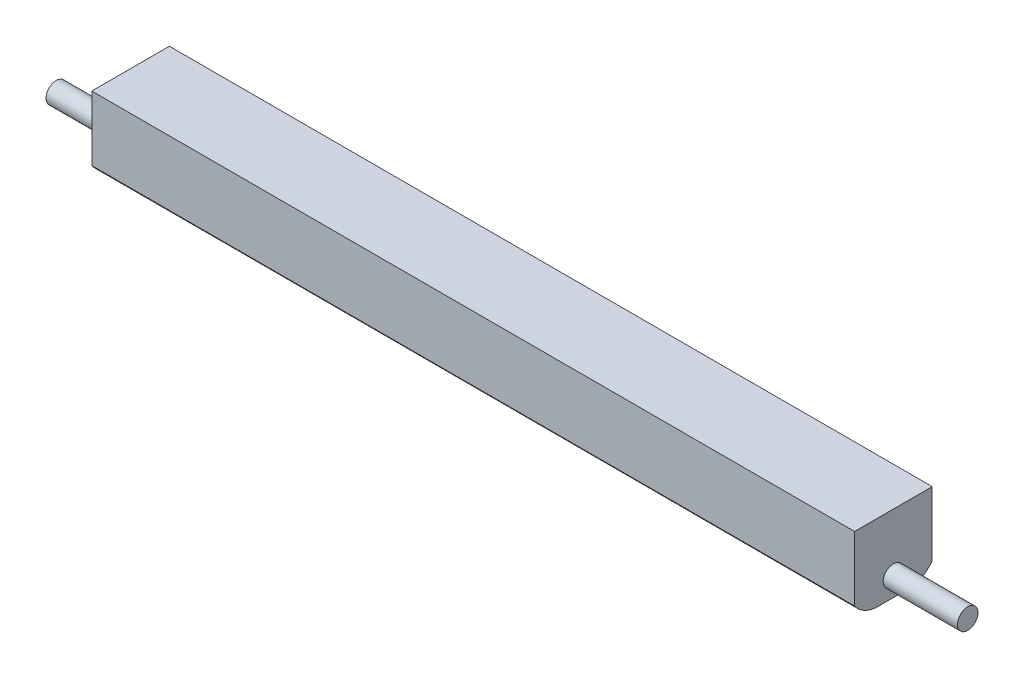
ISO-10303-21;
HEADER;
FILE_DESCRIPTION(('STEP AP214'),'2;1');
FILE_NAME('part.step','',(''),(''),'','','');
FILE_SCHEMA(('AUTOMOTIVE_DESIGN { 1 0 10303 214 1 1 1 1 }'));
ENDSEC;
DATA;
#1=APPLICATION_CONTEXT('core data for automotive mechanical design processes');
#2=APPLICATION_PROTOCOL_DEFINITION('international standard','automotive_design',2000,#1);
#3=PRODUCT_CONTEXT('',#1,'mechanical');
#4=PRODUCT('Part','Part','',(#3));
#5=PRODUCT_RELATED_PRODUCT_CATEGORY('part','',(#4));
#6=PRODUCT_DEFINITION_FORMATION('','',#4);
#7=PRODUCT_DEFINITION_CONTEXT('part definition',#1,'design');
#8=PRODUCT_DEFINITION('design','',#6,#7);
#9=PRODUCT_DEFINITION_SHAPE('','',#8);
#10=(LENGTH_UNIT() NAMED_UNIT(*) SI_UNIT(.MILLI.,.METRE.));
#11=(NAMED_UNIT(*) PLANE_ANGLE_UNIT() SI_UNIT($,.RADIAN.));
#12=(NAMED_UNIT(*) SI_UNIT($,.STERADIAN.) SOLID_ANGLE_UNIT());
#13=UNCERTAINTY_MEASURE_WITH_UNIT(LENGTH_MEASURE(1.E-05),#10,'distance_accuracy_value','');
#14=(GEOMETRIC_REPRESENTATION_CONTEXT(3) GLOBAL_UNCERTAINTY_ASSIGNED_CONTEXT((#13)) GLOBAL_UNIT_ASSIGNED_CONTEXT((#10,
#11,#12)) REPRESENTATION_CONTEXT('',''));
#15=CARTESIAN_POINT('',(0.,0.,0.));
#16=DIRECTION('',(0.,0.,1.));
#17=DIRECTION('',(1.,0.,0.));
#18=AXIS2_PLACEMENT_3D('',#15,#16,#17);
#19=CARTESIAN_POINT('',(1111.25,0.,0.));
#20=DIRECTION('',(-1.,0.,0.));
#21=DIRECTION('',(0.,0.,1.));
#22=AXIS2_PLACEMENT_3D('',#19,#20,#21);
#23=CYLINDRICAL_SURFACE('',#22,25.);
#24=CARTESIAN_POINT('',(1111.25,0.,0.));
#25=DIRECTION('',(1.,0.,0.));
#26=DIRECTION('',(0.,0.,-1.));
#27=AXIS2_PLACEMENT_3D('',#24,#25,#26);
#28=CIRCLE('',#27,25.);
#29=CARTESIAN_POINT('',(1111.25,0.,-25.));
#30=VERTEX_POINT('',#29);
#31=EDGE_CURVE('E11',#30,#30,#28,.T.);
#32=ORIENTED_EDGE('',*,*,#31,.F.);
#33=EDGE_LOOP('',(#32));
#34=FACE_BOUND('',#33,.T.);
#35=CARTESIAN_POINT('',(-1111.25,0.,0.));
#36=DIRECTION('',(1.,0.,0.));
#37=DIRECTION('',(0.,0.,-1.));
#38=AXIS2_PLACEMENT_3D('',#35,#36,#37);
#39=CIRCLE('',#38,25.);
#40=CARTESIAN_POINT('',(-1111.25,0.,-25.));
#41=VERTEX_POINT('',#40);
#42=EDGE_CURVE('E44',#41,#41,#39,.T.);
#43=ORIENTED_EDGE('',*,*,#42,.T.);
#44=EDGE_LOOP('',(#43));
#45=FACE_BOUND('',#44,.T.);
#46=ADVANCED_FACE('F41',(#34,#45),#23,.T.);
#47=CARTESIAN_POINT('',(1111.25,0.,0.));
#48=DIRECTION('',(1.,0.,0.));
#49=DIRECTION('',(0.,0.,-1.));
#50=AXIS2_PLACEMENT_3D('',#47,#48,#49);
#51=PLANE('',#50);
#52=ORIENTED_EDGE('',*,*,#31,.T.);
#53=EDGE_LOOP('',(#52));
#54=FACE_BOUND('',#53,.T.);
#55=ADVANCED_FACE('F56',(#54),#51,.T.);
#56=CARTESIAN_POINT('',(-1111.25,0.,0.));
#57=DIRECTION('',(1.,0.,0.));
#58=DIRECTION('',(0.,0.,-1.));
#59=AXIS2_PLACEMENT_3D('',#56,#57,#58);
#60=PLANE('',#59);
#61=ORIENTED_EDGE('',*,*,#42,.F.);
#62=EDGE_LOOP('',(#61));
#63=FACE_BOUND('',#62,.T.);
#64=ADVANCED_FACE('F54',(#63),#60,.F.);
#65=CLOSED_SHELL('',(#46,#55,#64));
#66=MANIFOLD_SOLID_BREP('B2',#65);
#67=CARTESIAN_POINT('',(930.000000042,140.618265245851,94.6345425258526));
#68=DIRECTION('',(0.,0.,-1.));
#69=DIRECTION('',(0.,1.,0.));
#70=AXIS2_PLACEMENT_3D('',#67,#68,#69);
#71=PLANE('',#70);
#72=DIRECTION('',(0.,-1.,0.));
#73=VECTOR('',#72,1.);
#74=CARTESIAN_POINT('',(-930.000000042,140.618265245851,94.6345425258526));
#75=LINE('',#74,#73);
#76=CARTESIAN_POINT('',(-930.000000042,140.618265245851,94.6345425258526));
#77=VERTEX_POINT('',#76);
#78=CARTESIAN_POINT('',(-930.000000042,-16.759321043142,94.6345425258526));
#79=VERTEX_POINT('',#78);
#80=EDGE_CURVE('E169',#77,#79,#75,.T.);
#81=ORIENTED_EDGE('',*,*,#80,.T.);
#82=DIRECTION('',(-1.,0.,0.));
#83=VECTOR('',#82,1.);
#84=CARTESIAN_POINT('',(930.000000042,-16.759321043142,94.6345425258526));
#85=LINE('',#84,#83);
#86=CARTESIAN_POINT('',(930.000000042,-16.759321043142,94.6345425258526));
#87=VERTEX_POINT('',#86);
#88=EDGE_CURVE('E39',#87,#79,#85,.T.);
#89=ORIENTED_EDGE('',*,*,#88,.F.);
#90=DIRECTION('',(0.,-1.,0.));
#91=VECTOR('',#90,1.);
#92=CARTESIAN_POINT('',(930.000000042,140.618265245851,94.6345425258526));
#93=LINE('',#92,#91);
#94=CARTESIAN_POINT('',(930.000000042,140.618265245851,94.6345425258526));
#95=VERTEX_POINT('',#94);
#96=EDGE_CURVE('E192',#95,#87,#93,.T.);
#97=ORIENTED_EDGE('',*,*,#96,.F.);
#98=DIRECTION('',(-1.,0.,0.));
#99=VECTOR('',#98,1.);
#100=CARTESIAN_POINT('',(930.000000042,140.618265245851,94.6345425258526));
#101=LINE('',#100,#99);
#102=EDGE_CURVE('E98',#95,#77,#101,.T.);
#103=ORIENTED_EDGE('',*,*,#102,.T.);
#104=EDGE_LOOP('',(#81,#89,#97,#103));
#105=FACE_BOUND('',#104,.T.);
#106=ADVANCED_FACE('F82',(#105),#71,.F.);
#107=CARTESIAN_POINT('',(930.000000042,-16.759321043142,94.6345425258526));
#108=CARTESIAN_POINT('',(930.000000042,-31.6852023182055,84.7963989369958));
#109=CARTESIAN_POINT('',(930.000000042,-41.5438730532494,69.2089918851332));
#110=CARTESIAN_POINT('',(930.000000042,-46.9662086533688,51.6290151755412));
#111=CARTESIAN_POINT('',(930.000000042,-46.3817347541492,38.3838603661238));
#112=B_SPLINE_CURVE_WITH_KNOTS('',4,(#107,#108,#109,#110,#111),.UNSPECIFIED.,.F.,.F.,(5,5),(0.,
1.),.UNSPECIFIED.);
#113=DIRECTION('',(-1.,0.,0.));
#114=VECTOR('',#113,1.);
#115=SURFACE_OF_LINEAR_EXTRUSION('',#112,#114);
#116=CARTESIAN_POINT('',(-930.000000042,-16.759321043142,94.6345425258526));
#117=CARTESIAN_POINT('',(-930.000000042,-31.6852023182055,84.7963989369958));
#118=CARTESIAN_POINT('',(-930.000000042,-41.5438730532494,69.2089918851332));
#119=CARTESIAN_POINT('',(-930.000000042,-46.9662086533688,51.6290151755412));
#120=CARTESIAN_POINT('',(-930.000000042,-46.3817347541492,38.3838603661238));
#121=B_SPLINE_CURVE_WITH_KNOTS('',4,(#116,#117,#118,#119,#120),.UNSPECIFIED.,.F.,.F.,(5,5),(0.,
1.),.UNSPECIFIED.);
#122=CARTESIAN_POINT('',(-930.000000042,-46.3817347541492,38.3838603661238));
#123=VERTEX_POINT('',#122);
#124=EDGE_CURVE('E171',#79,#123,#121,.T.);
#125=ORIENTED_EDGE('',*,*,#124,.T.);
#126=DIRECTION('',(-1.,0.,0.));
#127=VECTOR('',#126,1.);
#128=CARTESIAN_POINT('',(930.000000042,-46.3817347541492,38.3838603661238));
#129=LINE('',#128,#127);
#130=CARTESIAN_POINT('',(930.000000042,-46.3817347541492,38.3838603661238));
#131=VERTEX_POINT('',#130);
#132=EDGE_CURVE('E90',#131,#123,#129,.T.);
#133=ORIENTED_EDGE('',*,*,#132,.F.);
#134=EDGE_CURVE('E130',#87,#131,#112,.T.);
#135=ORIENTED_EDGE('',*,*,#134,.F.);
#136=ORIENTED_EDGE('',*,*,#88,.T.);
#137=EDGE_LOOP('',(#125,#133,#135,#136));
#138=FACE_BOUND('',#137,.T.);
#139=ADVANCED_FACE('F212',(#138),#115,.F.);
#140=CARTESIAN_POINT('',(930.000000042,-46.3817347541492,38.3838603661238));
#141=DIRECTION('',(0.,1.,0.));
#142=DIRECTION('',(0.,0.,1.));
#143=AXIS2_PLACEMENT_3D('',#140,#141,#142);
#144=PLANE('',#143);
#145=DIRECTION('',(0.,0.,-1.));
#146=VECTOR('',#145,1.);
#147=CARTESIAN_POINT('',(-930.000000042,-46.3817347541492,38.3838603661238));
#148=LINE('',#147,#146);
#149=CARTESIAN_POINT('',(-930.000000042,-46.3817347541492,-35.7004036733313));
#150=VERTEX_POINT('',#149);
#151=EDGE_CURVE('E175',#123,#150,#148,.T.);
#152=ORIENTED_EDGE('',*,*,#151,.T.);
#153=DIRECTION('',(-1.,0.,0.));
#154=VECTOR('',#153,1.);
#155=CARTESIAN_POINT('',(930.000000042,-46.3817347541492,-35.7004036733313));
#156=LINE('',#155,#154);
#157=CARTESIAN_POINT('',(930.000000042,-46.3817347541492,-35.7004036733313));
#158=VERTEX_POINT('',#157);
#159=EDGE_CURVE('E149',#158,#150,#156,.T.);
#160=ORIENTED_EDGE('',*,*,#159,.F.);
#161=DIRECTION('',(0.,0.,-1.));
#162=VECTOR('',#161,1.);
#163=CARTESIAN_POINT('',(930.000000042,-46.3817347541492,38.3838603661238));
#164=LINE('',#163,#162);
#165=EDGE_CURVE('E157',#131,#158,#164,.T.);
#166=ORIENTED_EDGE('',*,*,#165,.F.);
#167=ORIENTED_EDGE('',*,*,#132,.T.);
#168=EDGE_LOOP('',(#152,#160,#166,#167));
#169=FACE_BOUND('',#168,.T.);
#170=ADVANCED_FACE('F198',(#169),#144,.F.);
#171=CARTESIAN_POINT('',(930.000000042,-16.7593210593557,-94.634542525854));
#172=CARTESIAN_POINT('',(930.000000042,-47.7008450579014,-68.0888567377218));
#173=CARTESIAN_POINT('',(930.000000042,-46.3817347541492,-35.7004036733313));
#174=B_SPLINE_CURVE_WITH_KNOTS('',2,(#171,#172,#173),.UNSPECIFIED.,.F.,.F.,(3,3),(0.,
0.879181673912463),.UNSPECIFIED.);
#175=DIRECTION('',(-1.,0.,0.));
#176=VECTOR('',#175,1.);
#177=SURFACE_OF_LINEAR_EXTRUSION('',#174,#176);
#178=CARTESIAN_POINT('',(-930.000000042,-16.7593210593557,-94.634542525854));
#179=CARTESIAN_POINT('',(-930.000000042,-47.7008450579014,-68.0888567377218));
#180=CARTESIAN_POINT('',(-930.000000042,-46.3817347541492,-35.7004036733313));
#181=B_SPLINE_CURVE_WITH_KNOTS('',2,(#178,#179,#180),.UNSPECIFIED.,.F.,.F.,(3,3),(0.,
0.879181673912463),.UNSPECIFIED.);
#182=CARTESIAN_POINT('',(-930.000000042,-16.7593210593557,-94.634542525854));
#183=VERTEX_POINT('',#182);
#184=EDGE_CURVE('E145',#183,#150,#181,.T.);
#185=ORIENTED_EDGE('',*,*,#184,.F.);
#186=DIRECTION('',(-1.,0.,0.));
#187=VECTOR('',#186,1.);
#188=CARTESIAN_POINT('',(930.000000042,-16.7593210593557,-94.634542525854));
#189=LINE('',#188,#187);
#190=CARTESIAN_POINT('',(930.000000042,-16.7593210593557,-94.634542525854));
#191=VERTEX_POINT('',#190);
#192=EDGE_CURVE('E140',#191,#183,#189,.T.);
#193=ORIENTED_EDGE('',*,*,#192,.F.);
#194=EDGE_CURVE('E143',#191,#158,#174,.T.);
#195=ORIENTED_EDGE('',*,*,#194,.T.);
#196=ORIENTED_EDGE('',*,*,#159,.T.);
#197=EDGE_LOOP('',(#185,#193,#195,#196));
#198=FACE_BOUND('',#197,.T.);
#199=ADVANCED_FACE('F142',(#198),#177,.T.);
#200=CARTESIAN_POINT('',(930.000000042,140.618265245851,-94.634542525854));
#201=DIRECTION('',(0.,0.,-1.));
#202=DIRECTION('',(0.,1.,0.));
#203=AXIS2_PLACEMENT_3D('',#200,#201,#202);
#204=PLANE('',#203);
#205=DIRECTION('',(0.,-1.,0.));
#206=VECTOR('',#205,1.);
#207=CARTESIAN_POINT('',(-930.000000042,140.618265245851,-94.634542525854));
#208=LINE('',#207,#206);
#209=CARTESIAN_POINT('',(-930.000000042,140.618265245851,-94.634542525854));
#210=VERTEX_POINT('',#209);
#211=EDGE_CURVE('E184',#210,#183,#208,.T.);
#212=ORIENTED_EDGE('',*,*,#211,.F.);
#213=DIRECTION('',(-1.,0.,0.));
#214=VECTOR('',#213,1.);
#215=CARTESIAN_POINT('',(930.000000042,140.618265245851,-94.634542525854));
#216=LINE('',#215,#214);
#217=CARTESIAN_POINT('',(930.000000042,140.618265245851,-94.634542525854));
#218=VERTEX_POINT('',#217);
#219=EDGE_CURVE('E118',#218,#210,#216,.T.);
#220=ORIENTED_EDGE('',*,*,#219,.F.);
#221=DIRECTION('',(0.,-1.,0.));
#222=VECTOR('',#221,1.);
#223=CARTESIAN_POINT('',(930.000000042,140.618265245851,-94.634542525854));
#224=LINE('',#223,#222);
#225=EDGE_CURVE('E155',#218,#191,#224,.T.);
#226=ORIENTED_EDGE('',*,*,#225,.T.);
#227=ORIENTED_EDGE('',*,*,#192,.T.);
#228=EDGE_LOOP('',(#212,#220,#226,#227));
#229=FACE_BOUND('',#228,.T.);
#230=ADVANCED_FACE('F160',(#229),#204,.T.);
#231=CARTESIAN_POINT('',(930.000000042,140.618265245851,94.6345425258526));
#232=DIRECTION('',(0.,1.,0.));
#233=DIRECTION('',(0.,0.,1.));
#234=AXIS2_PLACEMENT_3D('',#231,#232,#233);
#235=PLANE('',#234);
#236=DIRECTION('',(0.,0.,-1.));
#237=VECTOR('',#236,1.);
#238=CARTESIAN_POINT('',(-930.000000042,140.618265245851,94.6345425258526));
#239=LINE('',#238,#237);
#240=EDGE_CURVE('E189',#77,#210,#239,.T.);
#241=ORIENTED_EDGE('',*,*,#240,.F.);
#242=ORIENTED_EDGE('',*,*,#102,.F.);
#243=DIRECTION('',(0.,0.,-1.));
#244=VECTOR('',#243,1.);
#245=CARTESIAN_POINT('',(930.000000042,140.618265245851,94.6345425258526));
#246=LINE('',#245,#244);
#247=EDGE_CURVE('E161',#95,#218,#246,.T.);
#248=ORIENTED_EDGE('',*,*,#247,.T.);
#249=ORIENTED_EDGE('',*,*,#219,.T.);
#250=EDGE_LOOP('',(#241,#242,#248,#249));
#251=FACE_BOUND('',#250,.T.);
#252=ADVANCED_FACE('F201',(#251),#235,.T.);
#253=CARTESIAN_POINT('',(930.000000042,-39.1881211251928,68.3733756658077));
#254=DIRECTION('',(-1.,0.,0.));
#255=DIRECTION('',(0.,0.,1.));
#256=AXIS2_PLACEMENT_3D('',#253,#254,#255);
#257=PLANE('',#256);
#258=ORIENTED_EDGE('',*,*,#96,.T.);
#259=ORIENTED_EDGE('',*,*,#134,.T.);
#260=ORIENTED_EDGE('',*,*,#165,.T.);
#261=ORIENTED_EDGE('',*,*,#194,.F.);
#262=ORIENTED_EDGE('',*,*,#225,.F.);
#263=ORIENTED_EDGE('',*,*,#247,.F.);
#264=EDGE_LOOP('',(#258,#259,#260,#261,#262,#263));
#265=FACE_BOUND('',#264,.T.);
#266=ADVANCED_FACE('F153',(#265),#257,.F.);
#267=CARTESIAN_POINT('',(-930.000000042,-39.1881211251928,68.3733756658077));
#268=DIRECTION('',(-1.,0.,0.));
#269=DIRECTION('',(0.,0.,1.));
#270=AXIS2_PLACEMENT_3D('',#267,#268,#269);
#271=PLANE('',#270);
#272=ORIENTED_EDGE('',*,*,#80,.F.);
#273=ORIENTED_EDGE('',*,*,#240,.T.);
#274=ORIENTED_EDGE('',*,*,#211,.T.);
#275=ORIENTED_EDGE('',*,*,#184,.T.);
#276=ORIENTED_EDGE('',*,*,#151,.F.);
#277=ORIENTED_EDGE('',*,*,#124,.F.);
#278=EDGE_LOOP('',(#272,#273,#274,#275,#276,#277));
#279=FACE_BOUND('',#278,.T.);
#280=ADVANCED_FACE('F200',(#279),#271,.T.);
#281=CLOSED_SHELL('',(#106,#139,#170,#199,#230,#252,#266,#280));
#282=MANIFOLD_SOLID_BREP('B6',#281);
#283=ADVANCED_BREP_SHAPE_REPRESENTATION('',(#18,#66,#282),#14);
#284=SHAPE_DEFINITION_REPRESENTATION(#9,#283);
ENDSEC;
END-ISO-10303-21;
